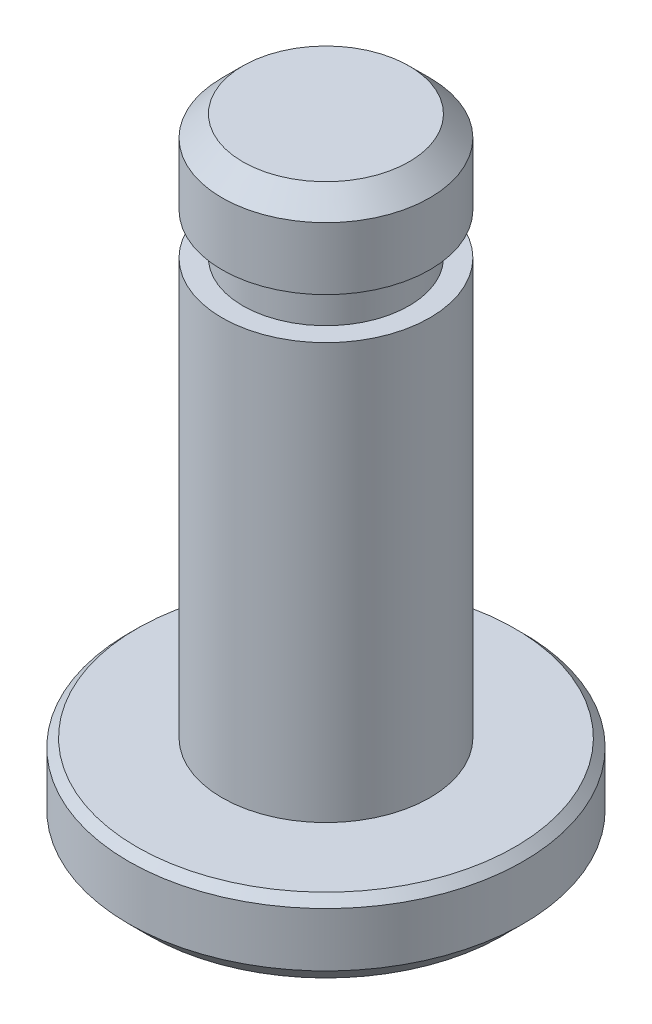
ISO-10303-21;
HEADER;
FILE_DESCRIPTION(('STEP AP214'),'2;1');
FILE_NAME('part.step','',(''),(''),'','','');
FILE_SCHEMA(('AUTOMOTIVE_DESIGN { 1 0 10303 214 1 1 1 1 }'));
ENDSEC;
DATA;
#1=APPLICATION_CONTEXT('core data for automotive mechanical design processes');
#2=APPLICATION_PROTOCOL_DEFINITION('international standard','automotive_design',2000,#1);
#3=PRODUCT_CONTEXT('',#1,'mechanical');
#4=PRODUCT('Part','Part','',(#3));
#5=PRODUCT_RELATED_PRODUCT_CATEGORY('part','',(#4));
#6=PRODUCT_DEFINITION_FORMATION('','',#4);
#7=PRODUCT_DEFINITION_CONTEXT('part definition',#1,'design');
#8=PRODUCT_DEFINITION('design','',#6,#7);
#9=PRODUCT_DEFINITION_SHAPE('','',#8);
#10=(LENGTH_UNIT() NAMED_UNIT(*) SI_UNIT(.MILLI.,.METRE.));
#11=(NAMED_UNIT(*) PLANE_ANGLE_UNIT() SI_UNIT($,.RADIAN.));
#12=(NAMED_UNIT(*) SI_UNIT($,.STERADIAN.) SOLID_ANGLE_UNIT());
#13=UNCERTAINTY_MEASURE_WITH_UNIT(LENGTH_MEASURE(1.E-05),#10,'distance_accuracy_value','');
#14=(GEOMETRIC_REPRESENTATION_CONTEXT(3) GLOBAL_UNCERTAINTY_ASSIGNED_CONTEXT((#13)) GLOBAL_UNIT_ASSIGNED_CONTEXT((#10,
#11,#12)) REPRESENTATION_CONTEXT('',''));
#15=CARTESIAN_POINT('',(0.,0.,0.));
#16=DIRECTION('',(0.,0.,1.));
#17=DIRECTION('',(1.,0.,0.));
#18=AXIS2_PLACEMENT_3D('',#15,#16,#17);
#19=CARTESIAN_POINT('',(0.,2.,0.));
#20=DIRECTION('',(0.,-1.,0.));
#21=DIRECTION('',(0.,0.,-1.));
#22=AXIS2_PLACEMENT_3D('',#19,#20,#21);
#23=CONICAL_SURFACE('',#22,4.55,0.785398163397442);
#24=CARTESIAN_POINT('',(0.,2.,0.));
#25=DIRECTION('',(0.,1.,0.));
#26=DIRECTION('',(0.,0.,1.));
#27=AXIS2_PLACEMENT_3D('',#24,#25,#26);
#28=CIRCLE('',#27,4.55);
#29=CARTESIAN_POINT('',(0.,2.,4.55));
#30=VERTEX_POINT('',#29);
#31=EDGE_CURVE('E11',#30,#30,#28,.T.);
#32=ORIENTED_EDGE('',*,*,#31,.F.);
#33=EDGE_LOOP('',(#32));
#34=FACE_BOUND('',#33,.T.);
#35=CARTESIAN_POINT('',(0.,1.8,0.));
#36=DIRECTION('',(0.,-1.,0.));
#37=DIRECTION('',(0.,0.,1.));
#38=AXIS2_PLACEMENT_3D('',#35,#36,#37);
#39=CIRCLE('',#38,4.75);
#40=CARTESIAN_POINT('',(0.,1.8,4.75));
#41=VERTEX_POINT('',#40);
#42=EDGE_CURVE('E27',#41,#41,#39,.T.);
#43=ORIENTED_EDGE('',*,*,#42,.F.);
#44=EDGE_LOOP('',(#43));
#45=FACE_BOUND('',#44,.T.);
#46=ADVANCED_FACE('F17',(#34,#45),#23,.T.);
#47=CARTESIAN_POINT('',(0.,2.,0.));
#48=DIRECTION('',(0.,1.,0.));
#49=DIRECTION('',(1.,0.,0.));
#50=AXIS2_PLACEMENT_3D('',#47,#48,#49);
#51=PLANE('',#50);
#52=CARTESIAN_POINT('',(0.,2.,0.));
#53=DIRECTION('',(0.,-1.,0.));
#54=DIRECTION('',(0.,0.,1.));
#55=AXIS2_PLACEMENT_3D('',#52,#53,#54);
#56=CIRCLE('',#55,2.5);
#57=CARTESIAN_POINT('',(0.,2.,2.5));
#58=VERTEX_POINT('',#57);
#59=EDGE_CURVE('E85',#58,#58,#56,.T.);
#60=ORIENTED_EDGE('',*,*,#59,.T.);
#61=EDGE_LOOP('',(#60));
#62=FACE_BOUND('',#61,.T.);
#63=ORIENTED_EDGE('',*,*,#31,.T.);
#64=EDGE_LOOP('',(#63));
#65=FACE_BOUND('',#64,.T.);
#66=ADVANCED_FACE('F249',(#62,#65),#51,.T.);
#67=CARTESIAN_POINT('',(0.,2.,0.));
#68=DIRECTION('',(0.,-1.,0.));
#69=DIRECTION('',(0.,0.,-1.));
#70=AXIS2_PLACEMENT_3D('',#67,#68,#69);
#71=CYLINDRICAL_SURFACE('',#70,4.75);
#72=ORIENTED_EDGE('',*,*,#42,.T.);
#73=EDGE_LOOP('',(#72));
#74=FACE_BOUND('',#73,.T.);
#75=CARTESIAN_POINT('',(0.,0.5,0.));
#76=DIRECTION('',(0.,1.,0.));
#77=DIRECTION('',(0.,0.,1.));
#78=AXIS2_PLACEMENT_3D('',#75,#76,#77);
#79=CIRCLE('',#78,4.75);
#80=CARTESIAN_POINT('',(0.,0.5,4.75));
#81=VERTEX_POINT('',#80);
#82=EDGE_CURVE('E69',#81,#81,#79,.T.);
#83=ORIENTED_EDGE('',*,*,#82,.T.);
#84=EDGE_LOOP('',(#83));
#85=FACE_BOUND('',#84,.T.);
#86=ADVANCED_FACE('F238',(#74,#85),#71,.T.);
#87=CARTESIAN_POINT('',(0.,0.5,0.));
#88=DIRECTION('',(0.,1.,0.));
#89=DIRECTION('',(0.,0.,1.));
#90=AXIS2_PLACEMENT_3D('',#87,#88,#89);
#91=CONICAL_SURFACE('',#90,4.75,0.78539816339745);
#92=CARTESIAN_POINT('',(0.,0.,0.));
#93=DIRECTION('',(0.,-1.,0.));
#94=DIRECTION('',(0.,0.,1.));
#95=AXIS2_PLACEMENT_3D('',#92,#93,#94);
#96=CIRCLE('',#95,4.25);
#97=CARTESIAN_POINT('',(0.,0.,4.25));
#98=VERTEX_POINT('',#97);
#99=EDGE_CURVE('E20',#98,#98,#96,.T.);
#100=ORIENTED_EDGE('',*,*,#99,.F.);
#101=EDGE_LOOP('',(#100));
#102=FACE_BOUND('',#101,.T.);
#103=ORIENTED_EDGE('',*,*,#82,.F.);
#104=EDGE_LOOP('',(#103));
#105=FACE_BOUND('',#104,.T.);
#106=ADVANCED_FACE('F228',(#102,#105),#91,.T.);
#107=CARTESIAN_POINT('',(0.,0.,0.));
#108=DIRECTION('',(0.,1.,0.));
#109=DIRECTION('',(1.,0.,0.));
#110=AXIS2_PLACEMENT_3D('',#107,#108,#109);
#111=PLANE('',#110);
#112=ORIENTED_EDGE('',*,*,#99,.T.);
#113=EDGE_LOOP('',(#112));
#114=FACE_BOUND('',#113,.T.);
#115=ADVANCED_FACE('F218',(#114),#111,.F.);
#116=CARTESIAN_POINT('',(0.,15.,0.));
#117=DIRECTION('',(0.,-1.,0.));
#118=DIRECTION('',(0.,0.,-1.));
#119=AXIS2_PLACEMENT_3D('',#116,#117,#118);
#120=CONICAL_SURFACE('',#119,2.,0.78539816339745);
#121=CARTESIAN_POINT('',(0.,15.,0.));
#122=DIRECTION('',(0.,1.,0.));
#123=DIRECTION('',(0.,0.,1.));
#124=AXIS2_PLACEMENT_3D('',#121,#122,#123);
#125=CIRCLE('',#124,2.);
#126=CARTESIAN_POINT('',(0.,15.,2.));
#127=VERTEX_POINT('',#126);
#128=EDGE_CURVE('E113',#127,#127,#125,.T.);
#129=ORIENTED_EDGE('',*,*,#128,.F.);
#130=EDGE_LOOP('',(#129));
#131=FACE_BOUND('',#130,.T.);
#132=CARTESIAN_POINT('',(0.,14.5,0.));
#133=DIRECTION('',(0.,-1.,0.));
#134=DIRECTION('',(0.,0.,1.));
#135=AXIS2_PLACEMENT_3D('',#132,#133,#134);
#136=CIRCLE('',#135,2.5);
#137=CARTESIAN_POINT('',(0.,14.5,2.5));
#138=VERTEX_POINT('',#137);
#139=EDGE_CURVE('E118',#138,#138,#136,.T.);
#140=ORIENTED_EDGE('',*,*,#139,.F.);
#141=EDGE_LOOP('',(#140));
#142=FACE_BOUND('',#141,.T.);
#143=ADVANCED_FACE('F208',(#131,#142),#120,.T.);
#144=CARTESIAN_POINT('',(0.,15.,0.));
#145=DIRECTION('',(0.,-1.,0.));
#146=DIRECTION('',(0.,0.,-1.));
#147=AXIS2_PLACEMENT_3D('',#144,#145,#146);
#148=CYLINDRICAL_SURFACE('',#147,2.5);
#149=ORIENTED_EDGE('',*,*,#139,.T.);
#150=EDGE_LOOP('',(#149));
#151=FACE_BOUND('',#150,.T.);
#152=CARTESIAN_POINT('',(0.,13.,0.));
#153=DIRECTION('',(0.,1.,0.));
#154=DIRECTION('',(0.,0.,1.));
#155=AXIS2_PLACEMENT_3D('',#152,#153,#154);
#156=CIRCLE('',#155,2.5);
#157=CARTESIAN_POINT('',(0.,13.,2.5));
#158=VERTEX_POINT('',#157);
#159=EDGE_CURVE('E95',#158,#158,#156,.T.);
#160=ORIENTED_EDGE('',*,*,#159,.T.);
#161=EDGE_LOOP('',(#160));
#162=FACE_BOUND('',#161,.T.);
#163=ADVANCED_FACE('F197',(#151,#162),#148,.T.);
#164=CARTESIAN_POINT('',(0.,15.,0.));
#165=DIRECTION('',(0.,1.,0.));
#166=DIRECTION('',(1.,0.,0.));
#167=AXIS2_PLACEMENT_3D('',#164,#165,#166);
#168=PLANE('',#167);
#169=ORIENTED_EDGE('',*,*,#128,.T.);
#170=EDGE_LOOP('',(#169));
#171=FACE_BOUND('',#170,.T.);
#172=ADVANCED_FACE('F187',(#171),#168,.T.);
#173=CARTESIAN_POINT('',(0.,13.,0.));
#174=DIRECTION('',(0.,-1.,0.));
#175=DIRECTION('',(0.,0.,-1.));
#176=AXIS2_PLACEMENT_3D('',#173,#174,#175);
#177=CYLINDRICAL_SURFACE('',#176,2.);
#178=CARTESIAN_POINT('',(0.,13.,0.));
#179=DIRECTION('',(0.,1.,0.));
#180=DIRECTION('',(0.,0.,1.));
#181=AXIS2_PLACEMENT_3D('',#178,#179,#180);
#182=CIRCLE('',#181,2.);
#183=CARTESIAN_POINT('',(0.,13.,2.));
#184=VERTEX_POINT('',#183);
#185=EDGE_CURVE('E102',#184,#184,#182,.T.);
#186=ORIENTED_EDGE('',*,*,#185,.F.);
#187=EDGE_LOOP('',(#186));
#188=FACE_BOUND('',#187,.T.);
#189=CARTESIAN_POINT('',(0.,12.,0.));
#190=DIRECTION('',(0.,1.,0.));
#191=DIRECTION('',(0.,0.,1.));
#192=AXIS2_PLACEMENT_3D('',#189,#190,#191);
#193=CIRCLE('',#192,2.);
#194=CARTESIAN_POINT('',(0.,12.,2.));
#195=VERTEX_POINT('',#194);
#196=EDGE_CURVE('E107',#195,#195,#193,.T.);
#197=ORIENTED_EDGE('',*,*,#196,.T.);
#198=EDGE_LOOP('',(#197));
#199=FACE_BOUND('',#198,.T.);
#200=ADVANCED_FACE('F176',(#188,#199),#177,.T.);
#201=CARTESIAN_POINT('',(0.,12.,0.));
#202=DIRECTION('',(0.,1.,0.));
#203=DIRECTION('',(1.,0.,0.));
#204=AXIS2_PLACEMENT_3D('',#201,#202,#203);
#205=PLANE('',#204);
#206=ORIENTED_EDGE('',*,*,#196,.F.);
#207=EDGE_LOOP('',(#206));
#208=FACE_BOUND('',#207,.T.);
#209=CARTESIAN_POINT('',(0.,12.,0.));
#210=DIRECTION('',(0.,1.,0.));
#211=DIRECTION('',(0.,0.,1.));
#212=AXIS2_PLACEMENT_3D('',#209,#210,#211);
#213=CIRCLE('',#212,2.5);
#214=CARTESIAN_POINT('',(0.,12.,2.5));
#215=VERTEX_POINT('',#214);
#216=EDGE_CURVE('E91',#215,#215,#213,.T.);
#217=ORIENTED_EDGE('',*,*,#216,.T.);
#218=EDGE_LOOP('',(#217));
#219=FACE_BOUND('',#218,.T.);
#220=ADVANCED_FACE('F92',(#208,#219),#205,.T.);
#221=CARTESIAN_POINT('',(0.,13.,0.));
#222=DIRECTION('',(0.,1.,0.));
#223=DIRECTION('',(1.,0.,0.));
#224=AXIS2_PLACEMENT_3D('',#221,#222,#223);
#225=PLANE('',#224);
#226=ORIENTED_EDGE('',*,*,#185,.T.);
#227=EDGE_LOOP('',(#226));
#228=FACE_BOUND('',#227,.T.);
#229=ORIENTED_EDGE('',*,*,#159,.F.);
#230=EDGE_LOOP('',(#229));
#231=FACE_BOUND('',#230,.T.);
#232=ADVANCED_FACE('F152',(#228,#231),#225,.F.);
#233=CARTESIAN_POINT('',(0.,15.,0.));
#234=DIRECTION('',(0.,-1.,0.));
#235=DIRECTION('',(0.,0.,-1.));
#236=AXIS2_PLACEMENT_3D('',#233,#234,#235);
#237=CYLINDRICAL_SURFACE('',#236,2.5);
#238=ORIENTED_EDGE('',*,*,#216,.F.);
#239=EDGE_LOOP('',(#238));
#240=FACE_BOUND('',#239,.T.);
#241=ORIENTED_EDGE('',*,*,#59,.F.);
#242=EDGE_LOOP('',(#241));
#243=FACE_BOUND('',#242,.T.);
#244=ADVANCED_FACE('F147',(#240,#243),#237,.T.);
#245=CLOSED_SHELL('',(#46,#66,#86,#106,#115,#143,#163,#172,#200,#220,#232,#244));
#246=MANIFOLD_SOLID_BREP('B1',#245);
#247=ADVANCED_BREP_SHAPE_REPRESENTATION('',(#18,#246),#14);
#248=SHAPE_DEFINITION_REPRESENTATION(#9,#247);
ENDSEC;
END-ISO-10303-21;
